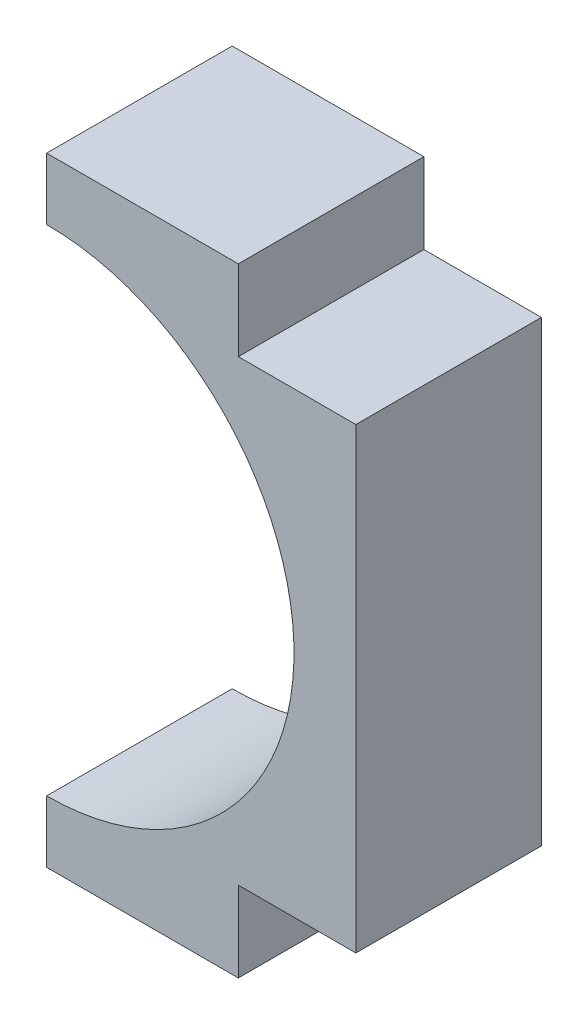
ISO-10303-21;
HEADER;
FILE_DESCRIPTION(('STEP AP214'),'2;1');
FILE_NAME('part.step','',(''),(''),'','','');
FILE_SCHEMA(('AUTOMOTIVE_DESIGN { 1 0 10303 214 1 1 1 1 }'));
ENDSEC;
DATA;
#1=APPLICATION_CONTEXT('core data for automotive mechanical design processes');
#2=APPLICATION_PROTOCOL_DEFINITION('international standard','automotive_design',2000,#1);
#3=PRODUCT_CONTEXT('',#1,'mechanical');
#4=PRODUCT('Part','Part','',(#3));
#5=PRODUCT_RELATED_PRODUCT_CATEGORY('part','',(#4));
#6=PRODUCT_DEFINITION_FORMATION('','',#4);
#7=PRODUCT_DEFINITION_CONTEXT('part definition',#1,'design');
#8=PRODUCT_DEFINITION('design','',#6,#7);
#9=PRODUCT_DEFINITION_SHAPE('','',#8);
#10=(LENGTH_UNIT() NAMED_UNIT(*) SI_UNIT(.MILLI.,.METRE.));
#11=(NAMED_UNIT(*) PLANE_ANGLE_UNIT() SI_UNIT($,.RADIAN.));
#12=(NAMED_UNIT(*) SI_UNIT($,.STERADIAN.) SOLID_ANGLE_UNIT());
#13=UNCERTAINTY_MEASURE_WITH_UNIT(LENGTH_MEASURE(1.E-05),#10,'distance_accuracy_value','');
#14=(GEOMETRIC_REPRESENTATION_CONTEXT(3) GLOBAL_UNCERTAINTY_ASSIGNED_CONTEXT((#13)) GLOBAL_UNIT_ASSIGNED_CONTEXT((#10,
#11,#12)) REPRESENTATION_CONTEXT('',''));
#15=CARTESIAN_POINT('',(0.,0.,0.));
#16=DIRECTION('',(0.,0.,1.));
#17=DIRECTION('',(1.,0.,0.));
#18=AXIS2_PLACEMENT_3D('',#15,#16,#17);
#19=CARTESIAN_POINT('',(0.,-50.,30.));
#20=DIRECTION('',(0.,1.,0.));
#21=DIRECTION('',(0.,0.,1.));
#22=AXIS2_PLACEMENT_3D('',#19,#20,#21);
#23=PLANE('',#22);
#24=DIRECTION('',(0.,0.,1.));
#25=VECTOR('',#24,1.);
#26=CARTESIAN_POINT('',(31.,-50.,0.));
#27=LINE('',#26,#25);
#28=CARTESIAN_POINT('',(31.,-50.,0.));
#29=VERTEX_POINT('',#28);
#30=CARTESIAN_POINT('',(31.,-50.,30.));
#31=VERTEX_POINT('',#30);
#32=EDGE_CURVE('E172',#29,#31,#27,.T.);
#33=ORIENTED_EDGE('',*,*,#32,.T.);
#34=DIRECTION('',(1.,0.,0.));
#35=VECTOR('',#34,1.);
#36=CARTESIAN_POINT('',(0.,-50.,30.));
#37=LINE('',#36,#35);
#38=CARTESIAN_POINT('',(0.,-50.,30.));
#39=VERTEX_POINT('',#38);
#40=EDGE_CURVE('E159',#39,#31,#37,.T.);
#41=ORIENTED_EDGE('',*,*,#40,.F.);
#42=DIRECTION('',(0.,0.,-1.));
#43=VECTOR('',#42,1.);
#44=CARTESIAN_POINT('',(0.,-50.,30.));
#45=LINE('',#44,#43);
#46=CARTESIAN_POINT('',(0.,-50.,0.));
#47=VERTEX_POINT('',#46);
#48=EDGE_CURVE('E49',#39,#47,#45,.T.);
#49=ORIENTED_EDGE('',*,*,#48,.T.);
#50=DIRECTION('',(1.,0.,0.));
#51=VECTOR('',#50,1.);
#52=CARTESIAN_POINT('',(0.,-50.,0.));
#53=LINE('',#52,#51);
#54=EDGE_CURVE('E138',#47,#29,#53,.T.);
#55=ORIENTED_EDGE('',*,*,#54,.T.);
#56=EDGE_LOOP('',(#33,#41,#49,#55));
#57=FACE_BOUND('',#56,.T.);
#58=ADVANCED_FACE('F41',(#57),#23,.F.);
#59=CARTESIAN_POINT('',(50.,0.,30.));
#60=DIRECTION('',(1.,0.,0.));
#61=DIRECTION('',(0.,1.,0.));
#62=AXIS2_PLACEMENT_3D('',#59,#60,#61);
#63=PLANE('',#62);
#64=DIRECTION('',(0.,-1.,0.));
#65=VECTOR('',#64,1.);
#66=CARTESIAN_POINT('',(50.,0.,30.));
#67=LINE('',#66,#65);
#68=CARTESIAN_POINT('',(50.,37.,30.));
#69=VERTEX_POINT('',#68);
#70=CARTESIAN_POINT('',(50.,-37.,30.));
#71=VERTEX_POINT('',#70);
#72=EDGE_CURVE('E133',#69,#71,#67,.T.);
#73=ORIENTED_EDGE('',*,*,#72,.T.);
#74=DIRECTION('',(0.,0.,1.));
#75=VECTOR('',#74,1.);
#76=CARTESIAN_POINT('',(50.,-37.,0.));
#77=LINE('',#76,#75);
#78=CARTESIAN_POINT('',(50.,-37.,0.));
#79=VERTEX_POINT('',#78);
#80=EDGE_CURVE('E118',#79,#71,#77,.T.);
#81=ORIENTED_EDGE('',*,*,#80,.F.);
#82=DIRECTION('',(0.,-1.,0.));
#83=VECTOR('',#82,1.);
#84=CARTESIAN_POINT('',(50.,0.,0.));
#85=LINE('',#84,#83);
#86=CARTESIAN_POINT('',(50.,37.,0.));
#87=VERTEX_POINT('',#86);
#88=EDGE_CURVE('E131',#87,#79,#85,.T.);
#89=ORIENTED_EDGE('',*,*,#88,.F.);
#90=DIRECTION('',(0.,0.,1.));
#91=VECTOR('',#90,1.);
#92=CARTESIAN_POINT('',(50.,37.,0.));
#93=LINE('',#92,#91);
#94=EDGE_CURVE('E184',#87,#69,#93,.T.);
#95=ORIENTED_EDGE('',*,*,#94,.T.);
#96=EDGE_LOOP('',(#73,#81,#89,#95));
#97=FACE_BOUND('',#96,.T.);
#98=ADVANCED_FACE('F129',(#97),#63,.T.);
#99=CARTESIAN_POINT('',(0.,0.,30.));
#100=DIRECTION('',(0.,0.,1.));
#101=DIRECTION('',(1.,0.,0.));
#102=AXIS2_PLACEMENT_3D('',#99,#100,#101);
#103=PLANE('',#102);
#104=ORIENTED_EDGE('',*,*,#40,.T.);
#105=DIRECTION('',(0.,1.,0.));
#106=VECTOR('',#105,1.);
#107=CARTESIAN_POINT('',(31.,-50.,30.));
#108=LINE('',#107,#106);
#109=CARTESIAN_POINT('',(31.,-37.,30.));
#110=VERTEX_POINT('',#109);
#111=EDGE_CURVE('E124',#31,#110,#108,.T.);
#112=ORIENTED_EDGE('',*,*,#111,.T.);
#113=DIRECTION('',(1.,0.,0.));
#114=VECTOR('',#113,1.);
#115=CARTESIAN_POINT('',(50.,-37.,30.));
#116=LINE('',#115,#114);
#117=EDGE_CURVE('E168',#110,#71,#116,.T.);
#118=ORIENTED_EDGE('',*,*,#117,.T.);
#119=ORIENTED_EDGE('',*,*,#72,.F.);
#120=DIRECTION('',(1.,0.,0.));
#121=VECTOR('',#120,1.);
#122=CARTESIAN_POINT('',(50.,37.,30.));
#123=LINE('',#122,#121);
#124=CARTESIAN_POINT('',(31.,37.,30.));
#125=VERTEX_POINT('',#124);
#126=EDGE_CURVE('E178',#125,#69,#123,.T.);
#127=ORIENTED_EDGE('',*,*,#126,.F.);
#128=DIRECTION('',(0.,-1.,0.));
#129=VECTOR('',#128,1.);
#130=CARTESIAN_POINT('',(31.,50.,30.));
#131=LINE('',#130,#129);
#132=CARTESIAN_POINT('',(31.,50.,30.));
#133=VERTEX_POINT('',#132);
#134=EDGE_CURVE('E174',#133,#125,#131,.T.);
#135=ORIENTED_EDGE('',*,*,#134,.F.);
#136=DIRECTION('',(1.,0.,0.));
#137=VECTOR('',#136,1.);
#138=CARTESIAN_POINT('',(0.,50.,30.));
#139=LINE('',#138,#137);
#140=CARTESIAN_POINT('',(0.,50.,30.));
#141=VERTEX_POINT('',#140);
#142=EDGE_CURVE('E197',#141,#133,#139,.T.);
#143=ORIENTED_EDGE('',*,*,#142,.F.);
#144=DIRECTION('',(0.,-1.,0.));
#145=VECTOR('',#144,1.);
#146=CARTESIAN_POINT('',(0.,0.,30.));
#147=LINE('',#146,#145);
#148=CARTESIAN_POINT('',(0.,40.,30.));
#149=VERTEX_POINT('',#148);
#150=EDGE_CURVE('E151',#141,#149,#147,.T.);
#151=ORIENTED_EDGE('',*,*,#150,.T.);
#152=CARTESIAN_POINT('',(0.,0.,30.));
#153=DIRECTION('',(0.,0.,1.));
#154=DIRECTION('',(1.,0.,0.));
#155=AXIS2_PLACEMENT_3D('',#152,#153,#154);
#156=CIRCLE('',#155,40.);
#157=CARTESIAN_POINT('',(0.,-40.,30.));
#158=VERTEX_POINT('',#157);
#159=EDGE_CURVE('E190',#158,#149,#156,.T.);
#160=ORIENTED_EDGE('',*,*,#159,.F.);
#161=EDGE_CURVE('E193',#158,#39,#147,.T.);
#162=ORIENTED_EDGE('',*,*,#161,.T.);
#163=EDGE_LOOP('',(#104,#112,#118,#119,#127,#135,#143,#151,#160,#162));
#164=FACE_BOUND('',#163,.T.);
#165=ADVANCED_FACE('F210',(#164),#103,.T.);
#166=CARTESIAN_POINT('',(0.,0.,0.));
#167=DIRECTION('',(0.,0.,1.));
#168=DIRECTION('',(1.,0.,0.));
#169=AXIS2_PLACEMENT_3D('',#166,#167,#168);
#170=PLANE('',#169);
#171=DIRECTION('',(0.,1.,0.));
#172=VECTOR('',#171,1.);
#173=CARTESIAN_POINT('',(31.,-50.,0.));
#174=LINE('',#173,#172);
#175=CARTESIAN_POINT('',(31.,-37.,0.));
#176=VERTEX_POINT('',#175);
#177=EDGE_CURVE('E123',#29,#176,#174,.T.);
#178=ORIENTED_EDGE('',*,*,#177,.F.);
#179=ORIENTED_EDGE('',*,*,#54,.F.);
#180=DIRECTION('',(0.,-1.,0.));
#181=VECTOR('',#180,1.);
#182=CARTESIAN_POINT('',(0.,0.,0.));
#183=LINE('',#182,#181);
#184=CARTESIAN_POINT('',(0.,-40.,0.));
#185=VERTEX_POINT('',#184);
#186=EDGE_CURVE('E144',#185,#47,#183,.T.);
#187=ORIENTED_EDGE('',*,*,#186,.F.);
#188=CARTESIAN_POINT('',(0.,0.,0.));
#189=DIRECTION('',(0.,0.,1.));
#190=DIRECTION('',(1.,0.,0.));
#191=AXIS2_PLACEMENT_3D('',#188,#189,#190);
#192=CIRCLE('',#191,40.);
#193=CARTESIAN_POINT('',(0.,40.,0.));
#194=VERTEX_POINT('',#193);
#195=EDGE_CURVE('E186',#185,#194,#192,.T.);
#196=ORIENTED_EDGE('',*,*,#195,.T.);
#197=CARTESIAN_POINT('',(0.,50.,0.));
#198=VERTEX_POINT('',#197);
#199=EDGE_CURVE('E141',#198,#194,#183,.T.);
#200=ORIENTED_EDGE('',*,*,#199,.F.);
#201=DIRECTION('',(1.,0.,0.));
#202=VECTOR('',#201,1.);
#203=CARTESIAN_POINT('',(0.,50.,0.));
#204=LINE('',#203,#202);
#205=CARTESIAN_POINT('',(31.,50.,0.));
#206=VERTEX_POINT('',#205);
#207=EDGE_CURVE('E137',#198,#206,#204,.T.);
#208=ORIENTED_EDGE('',*,*,#207,.T.);
#209=DIRECTION('',(0.,-1.,0.));
#210=VECTOR('',#209,1.);
#211=CARTESIAN_POINT('',(31.,50.,0.));
#212=LINE('',#211,#210);
#213=CARTESIAN_POINT('',(31.,37.,0.));
#214=VERTEX_POINT('',#213);
#215=EDGE_CURVE('E176',#206,#214,#212,.T.);
#216=ORIENTED_EDGE('',*,*,#215,.T.);
#217=DIRECTION('',(1.,0.,0.));
#218=VECTOR('',#217,1.);
#219=CARTESIAN_POINT('',(50.,37.,0.));
#220=LINE('',#219,#218);
#221=EDGE_CURVE('E64',#214,#87,#220,.T.);
#222=ORIENTED_EDGE('',*,*,#221,.T.);
#223=ORIENTED_EDGE('',*,*,#88,.T.);
#224=DIRECTION('',(1.,0.,0.));
#225=VECTOR('',#224,1.);
#226=CARTESIAN_POINT('',(50.,-37.,0.));
#227=LINE('',#226,#225);
#228=EDGE_CURVE('E115',#176,#79,#227,.T.);
#229=ORIENTED_EDGE('',*,*,#228,.F.);
#230=EDGE_LOOP('',(#178,#179,#187,#196,#200,#208,#216,#222,#223,#229));
#231=FACE_BOUND('',#230,.T.);
#232=ADVANCED_FACE('F135',(#231),#170,.F.);
#233=CARTESIAN_POINT('',(0.,0.,30.));
#234=DIRECTION('',(0.,0.,-1.));
#235=DIRECTION('',(-1.,0.,0.));
#236=AXIS2_PLACEMENT_3D('',#233,#234,#235);
#237=CYLINDRICAL_SURFACE('',#236,40.);
#238=ORIENTED_EDGE('',*,*,#195,.F.);
#239=DIRECTION('',(0.,0.,-1.));
#240=VECTOR('',#239,1.);
#241=CARTESIAN_POINT('',(0.,-40.,30.));
#242=LINE('',#241,#240);
#243=EDGE_CURVE('E11',#158,#185,#242,.T.);
#244=ORIENTED_EDGE('',*,*,#243,.F.);
#245=ORIENTED_EDGE('',*,*,#159,.T.);
#246=DIRECTION('',(0.,0.,-1.));
#247=VECTOR('',#246,1.);
#248=CARTESIAN_POINT('',(0.,40.,30.));
#249=LINE('',#248,#247);
#250=EDGE_CURVE('E148',#149,#194,#249,.T.);
#251=ORIENTED_EDGE('',*,*,#250,.T.);
#252=EDGE_LOOP('',(#238,#244,#245,#251));
#253=FACE_BOUND('',#252,.T.);
#254=ADVANCED_FACE('F43',(#253),#237,.F.);
#255=CARTESIAN_POINT('',(0.,0.,30.));
#256=DIRECTION('',(1.,0.,0.));
#257=DIRECTION('',(0.,1.,0.));
#258=AXIS2_PLACEMENT_3D('',#255,#256,#257);
#259=PLANE('',#258);
#260=ORIENTED_EDGE('',*,*,#186,.T.);
#261=ORIENTED_EDGE('',*,*,#48,.F.);
#262=ORIENTED_EDGE('',*,*,#161,.F.);
#263=ORIENTED_EDGE('',*,*,#243,.T.);
#264=EDGE_LOOP('',(#260,#261,#262,#263));
#265=FACE_BOUND('',#264,.T.);
#266=ADVANCED_FACE('F238',(#265),#259,.F.);
#267=CARTESIAN_POINT('',(0.,50.,30.));
#268=DIRECTION('',(0.,1.,0.));
#269=DIRECTION('',(0.,0.,1.));
#270=AXIS2_PLACEMENT_3D('',#267,#268,#269);
#271=PLANE('',#270);
#272=DIRECTION('',(0.,0.,1.));
#273=VECTOR('',#272,1.);
#274=CARTESIAN_POINT('',(31.,50.,0.));
#275=LINE('',#274,#273);
#276=EDGE_CURVE('E180',#206,#133,#275,.T.);
#277=ORIENTED_EDGE('',*,*,#276,.F.);
#278=ORIENTED_EDGE('',*,*,#207,.F.);
#279=DIRECTION('',(0.,0.,-1.));
#280=VECTOR('',#279,1.);
#281=CARTESIAN_POINT('',(0.,50.,30.));
#282=LINE('',#281,#280);
#283=EDGE_CURVE('E150',#141,#198,#282,.T.);
#284=ORIENTED_EDGE('',*,*,#283,.F.);
#285=ORIENTED_EDGE('',*,*,#142,.T.);
#286=EDGE_LOOP('',(#277,#278,#284,#285));
#287=FACE_BOUND('',#286,.T.);
#288=ADVANCED_FACE('F216',(#287),#271,.T.);
#289=ORIENTED_EDGE('',*,*,#199,.T.);
#290=ORIENTED_EDGE('',*,*,#250,.F.);
#291=ORIENTED_EDGE('',*,*,#150,.F.);
#292=ORIENTED_EDGE('',*,*,#283,.T.);
#293=EDGE_LOOP('',(#289,#290,#291,#292));
#294=FACE_BOUND('',#293,.T.);
#295=ADVANCED_FACE('F204',(#294),#259,.F.);
#296=CARTESIAN_POINT('',(50.,37.,0.));
#297=DIRECTION('',(0.,-1.,0.));
#298=DIRECTION('',(0.,0.,-1.));
#299=AXIS2_PLACEMENT_3D('',#296,#297,#298);
#300=PLANE('',#299);
#301=ORIENTED_EDGE('',*,*,#126,.T.);
#302=ORIENTED_EDGE('',*,*,#94,.F.);
#303=ORIENTED_EDGE('',*,*,#221,.F.);
#304=DIRECTION('',(0.,0.,1.));
#305=VECTOR('',#304,1.);
#306=CARTESIAN_POINT('',(31.,37.,0.));
#307=LINE('',#306,#305);
#308=EDGE_CURVE('E187',#214,#125,#307,.T.);
#309=ORIENTED_EDGE('',*,*,#308,.T.);
#310=EDGE_LOOP('',(#301,#302,#303,#309));
#311=FACE_BOUND('',#310,.T.);
#312=ADVANCED_FACE('F219',(#311),#300,.F.);
#313=CARTESIAN_POINT('',(31.,50.,0.));
#314=DIRECTION('',(-1.,0.,0.));
#315=DIRECTION('',(0.,0.,1.));
#316=AXIS2_PLACEMENT_3D('',#313,#314,#315);
#317=PLANE('',#316);
#318=ORIENTED_EDGE('',*,*,#134,.T.);
#319=ORIENTED_EDGE('',*,*,#308,.F.);
#320=ORIENTED_EDGE('',*,*,#215,.F.);
#321=ORIENTED_EDGE('',*,*,#276,.T.);
#322=EDGE_LOOP('',(#318,#319,#320,#321));
#323=FACE_BOUND('',#322,.T.);
#324=ADVANCED_FACE('F218',(#323),#317,.F.);
#325=CARTESIAN_POINT('',(31.,-50.,0.));
#326=DIRECTION('',(1.,0.,0.));
#327=DIRECTION('',(0.,0.,-1.));
#328=AXIS2_PLACEMENT_3D('',#325,#326,#327);
#329=PLANE('',#328);
#330=ORIENTED_EDGE('',*,*,#111,.F.);
#331=ORIENTED_EDGE('',*,*,#32,.F.);
#332=ORIENTED_EDGE('',*,*,#177,.T.);
#333=DIRECTION('',(0.,0.,1.));
#334=VECTOR('',#333,1.);
#335=CARTESIAN_POINT('',(31.,-37.,0.));
#336=LINE('',#335,#334);
#337=EDGE_CURVE('E56',#176,#110,#336,.T.);
#338=ORIENTED_EDGE('',*,*,#337,.T.);
#339=EDGE_LOOP('',(#330,#331,#332,#338));
#340=FACE_BOUND('',#339,.T.);
#341=ADVANCED_FACE('F220',(#340),#329,.T.);
#342=CARTESIAN_POINT('',(50.,-37.,0.));
#343=DIRECTION('',(0.,-1.,0.));
#344=DIRECTION('',(0.,0.,-1.));
#345=AXIS2_PLACEMENT_3D('',#342,#343,#344);
#346=PLANE('',#345);
#347=ORIENTED_EDGE('',*,*,#117,.F.);
#348=ORIENTED_EDGE('',*,*,#337,.F.);
#349=ORIENTED_EDGE('',*,*,#228,.T.);
#350=ORIENTED_EDGE('',*,*,#80,.T.);
#351=EDGE_LOOP('',(#347,#348,#349,#350));
#352=FACE_BOUND('',#351,.T.);
#353=ADVANCED_FACE('F117',(#352),#346,.T.);
#354=CLOSED_SHELL('',(#58,#98,#165,#232,#254,#266,#288,#295,#312,#324,#341,#353));
#355=MANIFOLD_SOLID_BREP('B2',#354);
#356=ADVANCED_BREP_SHAPE_REPRESENTATION('',(#18,#355),#14);
#357=SHAPE_DEFINITION_REPRESENTATION(#9,#356);
ENDSEC;
END-ISO-10303-21;
